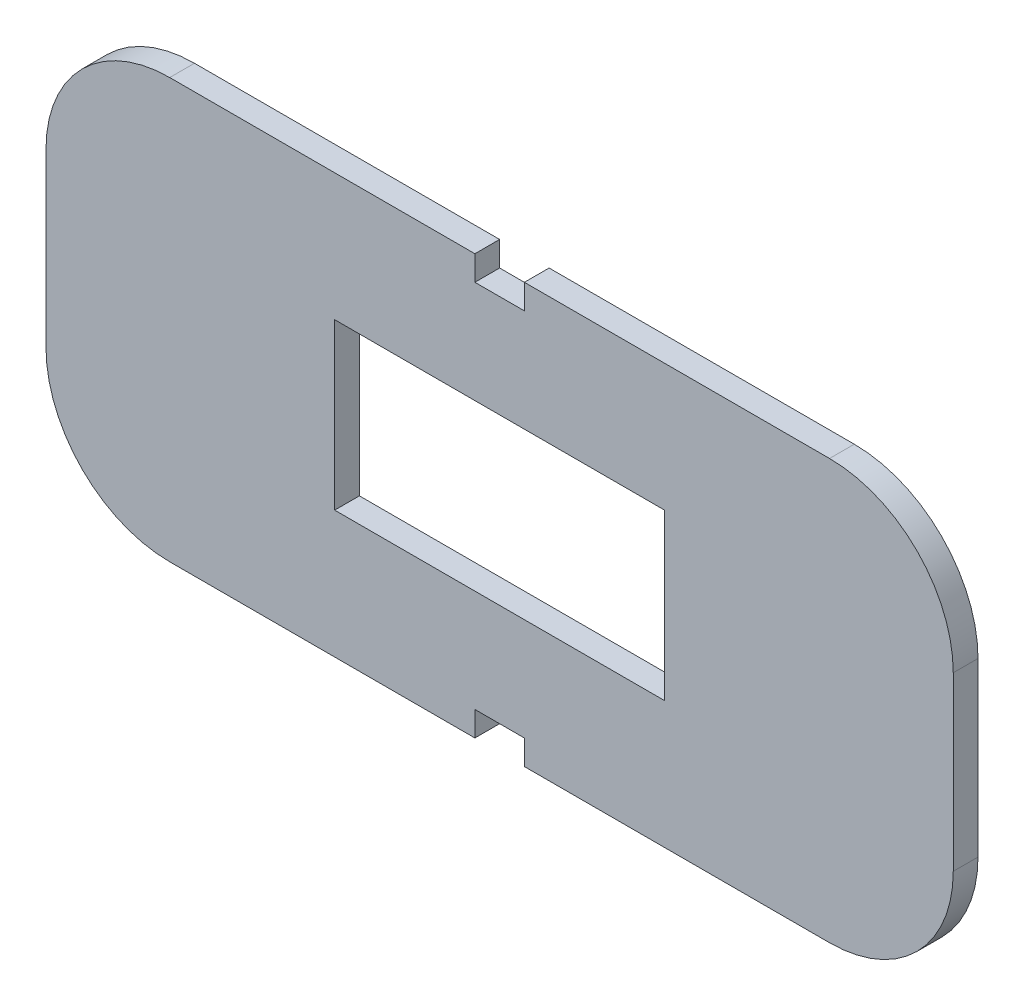
ISO-10303-21;
HEADER;
FILE_DESCRIPTION(('STEP AP214'),'2;1');
FILE_NAME('part.step','',(''),(''),'','','');
FILE_SCHEMA(('AUTOMOTIVE_DESIGN { 1 0 10303 214 1 1 1 1 }'));
ENDSEC;
DATA;
#1=APPLICATION_CONTEXT('core data for automotive mechanical design processes');
#2=APPLICATION_PROTOCOL_DEFINITION('international standard','automotive_design',2000,#1);
#3=PRODUCT_CONTEXT('',#1,'mechanical');
#4=PRODUCT('Part','Part','',(#3));
#5=PRODUCT_RELATED_PRODUCT_CATEGORY('part','',(#4));
#6=PRODUCT_DEFINITION_FORMATION('','',#4);
#7=PRODUCT_DEFINITION_CONTEXT('part definition',#1,'design');
#8=PRODUCT_DEFINITION('design','',#6,#7);
#9=PRODUCT_DEFINITION_SHAPE('','',#8);
#10=(LENGTH_UNIT() NAMED_UNIT(*) SI_UNIT(.MILLI.,.METRE.));
#11=(NAMED_UNIT(*) PLANE_ANGLE_UNIT() SI_UNIT($,.RADIAN.));
#12=(NAMED_UNIT(*) SI_UNIT($,.STERADIAN.) SOLID_ANGLE_UNIT());
#13=UNCERTAINTY_MEASURE_WITH_UNIT(LENGTH_MEASURE(1.E-05),#10,'distance_accuracy_value','');
#14=(GEOMETRIC_REPRESENTATION_CONTEXT(3) GLOBAL_UNCERTAINTY_ASSIGNED_CONTEXT((#13)) GLOBAL_UNIT_ASSIGNED_CONTEXT((#10,
#11,#12)) REPRESENTATION_CONTEXT('',''));
#15=CARTESIAN_POINT('',(0.,0.,0.));
#16=DIRECTION('',(0.,0.,1.));
#17=DIRECTION('',(1.,0.,0.));
#18=AXIS2_PLACEMENT_3D('',#15,#16,#17);
#19=CARTESIAN_POINT('',(0.,0.,3.));
#20=DIRECTION('',(-1.,0.,0.));
#21=DIRECTION('',(0.,-1.,0.));
#22=AXIS2_PLACEMENT_3D('',#19,#20,#21);
#23=PLANE('',#22);
#24=DIRECTION('',(0.,1.,0.));
#25=VECTOR('',#24,1.);
#26=CARTESIAN_POINT('',(0.,0.,0.));
#27=LINE('',#26,#25);
#28=CARTESIAN_POINT('',(0.,15.,0.));
#29=VERTEX_POINT('',#28);
#30=CARTESIAN_POINT('',(0.,35.85,0.));
#31=VERTEX_POINT('',#30);
#32=EDGE_CURVE('E281',#29,#31,#27,.T.);
#33=ORIENTED_EDGE('',*,*,#32,.F.);
#34=DIRECTION('',(0.,0.,-1.));
#35=VECTOR('',#34,1.);
#36=CARTESIAN_POINT('',(0.,15.,3.));
#37=LINE('',#36,#35);
#38=CARTESIAN_POINT('',(0.,15.,3.));
#39=VERTEX_POINT('',#38);
#40=EDGE_CURVE('E419',#29,#39,#37,.F.);
#41=ORIENTED_EDGE('',*,*,#40,.T.);
#42=DIRECTION('',(0.,1.,0.));
#43=VECTOR('',#42,1.);
#44=CARTESIAN_POINT('',(0.,0.,3.));
#45=LINE('',#44,#43);
#46=CARTESIAN_POINT('',(0.,35.85,3.));
#47=VERTEX_POINT('',#46);
#48=EDGE_CURVE('E287',#39,#47,#45,.T.);
#49=ORIENTED_EDGE('',*,*,#48,.T.);
#50=DIRECTION('',(0.,0.,-1.));
#51=VECTOR('',#50,1.);
#52=CARTESIAN_POINT('',(0.,35.85,3.));
#53=LINE('',#52,#51);
#54=EDGE_CURVE('E415',#47,#31,#53,.T.);
#55=ORIENTED_EDGE('',*,*,#54,.T.);
#56=EDGE_LOOP('',(#33,#41,#49,#55));
#57=FACE_BOUND('',#56,.T.);
#58=ADVANCED_FACE('F91',(#57),#23,.T.);
#59=CARTESIAN_POINT('',(0.,0.,3.));
#60=DIRECTION('',(0.,1.,0.));
#61=DIRECTION('',(-1.,0.,0.));
#62=AXIS2_PLACEMENT_3D('',#59,#60,#61);
#63=PLANE('',#62);
#64=DIRECTION('',(1.,0.,0.));
#65=VECTOR('',#64,1.);
#66=CARTESIAN_POINT('',(0.,0.,3.));
#67=LINE('',#66,#65);
#68=CARTESIAN_POINT('',(15.,0.,3.));
#69=VERTEX_POINT('',#68);
#70=CARTESIAN_POINT('',(52.,0.,3.));
#71=VERTEX_POINT('',#70);
#72=EDGE_CURVE('E326',#69,#71,#67,.T.);
#73=ORIENTED_EDGE('',*,*,#72,.F.);
#74=DIRECTION('',(0.,0.,-1.));
#75=VECTOR('',#74,1.);
#76=CARTESIAN_POINT('',(15.,0.,0.));
#77=LINE('',#76,#75);
#78=CARTESIAN_POINT('',(15.,0.,0.));
#79=VERTEX_POINT('',#78);
#80=EDGE_CURVE('E375',#69,#79,#77,.T.);
#81=ORIENTED_EDGE('',*,*,#80,.T.);
#82=DIRECTION('',(1.,0.,0.));
#83=VECTOR('',#82,1.);
#84=CARTESIAN_POINT('',(0.,0.,0.));
#85=LINE('',#84,#83);
#86=CARTESIAN_POINT('',(52.,0.,0.));
#87=VERTEX_POINT('',#86);
#88=EDGE_CURVE('E292',#79,#87,#85,.T.);
#89=ORIENTED_EDGE('',*,*,#88,.T.);
#90=DIRECTION('',(0.,0.,-1.));
#91=VECTOR('',#90,1.);
#92=CARTESIAN_POINT('',(52.,0.,3.));
#93=LINE('',#92,#91);
#94=EDGE_CURVE('E371',#71,#87,#93,.T.);
#95=ORIENTED_EDGE('',*,*,#94,.F.);
#96=EDGE_LOOP('',(#73,#81,#89,#95));
#97=FACE_BOUND('',#96,.T.);
#98=ADVANCED_FACE('F495',(#97),#63,.F.);
#99=CARTESIAN_POINT('',(52.,0.,3.));
#100=DIRECTION('',(-1.,0.,0.));
#101=DIRECTION('',(0.,-1.,0.));
#102=AXIS2_PLACEMENT_3D('',#99,#100,#101);
#103=PLANE('',#102);
#104=DIRECTION('',(0.,1.,0.));
#105=VECTOR('',#104,1.);
#106=CARTESIAN_POINT('',(52.,0.,0.));
#107=LINE('',#106,#105);
#108=CARTESIAN_POINT('',(52.,2.99999999999998,0.));
#109=VERTEX_POINT('',#108);
#110=EDGE_CURVE('E366',#87,#109,#107,.T.);
#111=ORIENTED_EDGE('',*,*,#110,.T.);
#112=DIRECTION('',(0.,0.,-1.));
#113=VECTOR('',#112,1.);
#114=CARTESIAN_POINT('',(52.,2.99999999999998,3.));
#115=LINE('',#114,#113);
#116=CARTESIAN_POINT('',(52.,2.99999999999998,3.));
#117=VERTEX_POINT('',#116);
#118=EDGE_CURVE('E376',#117,#109,#115,.T.);
#119=ORIENTED_EDGE('',*,*,#118,.F.);
#120=DIRECTION('',(0.,1.,0.));
#121=VECTOR('',#120,1.);
#122=CARTESIAN_POINT('',(52.,0.,3.));
#123=LINE('',#122,#121);
#124=EDGE_CURVE('E323',#71,#117,#123,.T.);
#125=ORIENTED_EDGE('',*,*,#124,.F.);
#126=ORIENTED_EDGE('',*,*,#94,.T.);
#127=EDGE_LOOP('',(#111,#119,#125,#126));
#128=FACE_BOUND('',#127,.T.);
#129=ADVANCED_FACE('F502',(#128),#103,.F.);
#130=CARTESIAN_POINT('',(52.,2.99999999999998,3.));
#131=DIRECTION('',(0.,1.,0.));
#132=DIRECTION('',(0.,0.,1.));
#133=AXIS2_PLACEMENT_3D('',#130,#131,#132);
#134=PLANE('',#133);
#135=DIRECTION('',(1.,0.,0.));
#136=VECTOR('',#135,1.);
#137=CARTESIAN_POINT('',(52.,2.99999999999998,0.));
#138=LINE('',#137,#136);
#139=CARTESIAN_POINT('',(58.,2.99999999999998,0.));
#140=VERTEX_POINT('',#139);
#141=EDGE_CURVE('E363',#109,#140,#138,.T.);
#142=ORIENTED_EDGE('',*,*,#141,.T.);
#143=DIRECTION('',(0.,0.,-1.));
#144=VECTOR('',#143,1.);
#145=CARTESIAN_POINT('',(58.,2.99999999999998,3.));
#146=LINE('',#145,#144);
#147=CARTESIAN_POINT('',(58.,2.99999999999998,3.));
#148=VERTEX_POINT('',#147);
#149=EDGE_CURVE('E380',#148,#140,#146,.T.);
#150=ORIENTED_EDGE('',*,*,#149,.F.);
#151=DIRECTION('',(1.,0.,0.));
#152=VECTOR('',#151,1.);
#153=CARTESIAN_POINT('',(52.,2.99999999999998,3.));
#154=LINE('',#153,#152);
#155=EDGE_CURVE('E320',#117,#148,#154,.T.);
#156=ORIENTED_EDGE('',*,*,#155,.F.);
#157=ORIENTED_EDGE('',*,*,#118,.T.);
#158=EDGE_LOOP('',(#142,#150,#156,#157));
#159=FACE_BOUND('',#158,.T.);
#160=ADVANCED_FACE('F505',(#159),#134,.F.);
#161=CARTESIAN_POINT('',(58.,2.99999999999998,3.));
#162=DIRECTION('',(1.,0.,0.));
#163=DIRECTION('',(0.,1.,0.));
#164=AXIS2_PLACEMENT_3D('',#161,#162,#163);
#165=PLANE('',#164);
#166=DIRECTION('',(0.,-1.,0.));
#167=VECTOR('',#166,1.);
#168=CARTESIAN_POINT('',(58.,2.99999999999998,0.));
#169=LINE('',#168,#167);
#170=CARTESIAN_POINT('',(58.,0.,0.));
#171=VERTEX_POINT('',#170);
#172=EDGE_CURVE('E360',#140,#171,#169,.T.);
#173=ORIENTED_EDGE('',*,*,#172,.T.);
#174=DIRECTION('',(0.,0.,-1.));
#175=VECTOR('',#174,1.);
#176=CARTESIAN_POINT('',(58.,0.,3.));
#177=LINE('',#176,#175);
#178=CARTESIAN_POINT('',(58.,0.,3.));
#179=VERTEX_POINT('',#178);
#180=EDGE_CURVE('E384',#179,#171,#177,.T.);
#181=ORIENTED_EDGE('',*,*,#180,.F.);
#182=DIRECTION('',(0.,-1.,0.));
#183=VECTOR('',#182,1.);
#184=CARTESIAN_POINT('',(58.,2.99999999999998,3.));
#185=LINE('',#184,#183);
#186=EDGE_CURVE('E317',#148,#179,#185,.T.);
#187=ORIENTED_EDGE('',*,*,#186,.F.);
#188=ORIENTED_EDGE('',*,*,#149,.T.);
#189=EDGE_LOOP('',(#173,#181,#187,#188));
#190=FACE_BOUND('',#189,.T.);
#191=ADVANCED_FACE('F508',(#190),#165,.F.);
#192=CARTESIAN_POINT('',(58.,0.,3.));
#193=DIRECTION('',(0.,1.,0.));
#194=DIRECTION('',(-1.,0.,0.));
#195=AXIS2_PLACEMENT_3D('',#192,#193,#194);
#196=PLANE('',#195);
#197=DIRECTION('',(1.,0.,0.));
#198=VECTOR('',#197,1.);
#199=CARTESIAN_POINT('',(58.,0.,0.));
#200=LINE('',#199,#198);
#201=CARTESIAN_POINT('',(95.,0.,0.));
#202=VERTEX_POINT('',#201);
#203=EDGE_CURVE('E356',#171,#202,#200,.T.);
#204=ORIENTED_EDGE('',*,*,#203,.T.);
#205=DIRECTION('',(0.,0.,-1.));
#206=VECTOR('',#205,1.);
#207=CARTESIAN_POINT('',(95.,0.,3.));
#208=LINE('',#207,#206);
#209=CARTESIAN_POINT('',(95.,0.,3.));
#210=VERTEX_POINT('',#209);
#211=EDGE_CURVE('E100',#202,#210,#208,.F.);
#212=ORIENTED_EDGE('',*,*,#211,.T.);
#213=DIRECTION('',(1.,0.,0.));
#214=VECTOR('',#213,1.);
#215=CARTESIAN_POINT('',(58.,0.,3.));
#216=LINE('',#215,#214);
#217=EDGE_CURVE('E313',#179,#210,#216,.T.);
#218=ORIENTED_EDGE('',*,*,#217,.F.);
#219=ORIENTED_EDGE('',*,*,#180,.T.);
#220=EDGE_LOOP('',(#204,#212,#218,#219));
#221=FACE_BOUND('',#220,.T.);
#222=ADVANCED_FACE('F445',(#221),#196,.F.);
#223=CARTESIAN_POINT('',(110.,0.,3.));
#224=DIRECTION('',(-1.,0.,0.));
#225=DIRECTION('',(0.,0.,1.));
#226=AXIS2_PLACEMENT_3D('',#223,#224,#225);
#227=PLANE('',#226);
#228=DIRECTION('',(0.,1.,0.));
#229=VECTOR('',#228,1.);
#230=CARTESIAN_POINT('',(110.,0.,3.));
#231=LINE('',#230,#229);
#232=CARTESIAN_POINT('',(110.,15.,3.));
#233=VERTEX_POINT('',#232);
#234=CARTESIAN_POINT('',(110.,35.85,3.));
#235=VERTEX_POINT('',#234);
#236=EDGE_CURVE('E310',#233,#235,#231,.T.);
#237=ORIENTED_EDGE('',*,*,#236,.F.);
#238=DIRECTION('',(0.,0.,-1.));
#239=VECTOR('',#238,1.);
#240=CARTESIAN_POINT('',(110.,15.,3.));
#241=LINE('',#240,#239);
#242=CARTESIAN_POINT('',(110.,15.,0.));
#243=VERTEX_POINT('',#242);
#244=EDGE_CURVE('E438',#233,#243,#241,.T.);
#245=ORIENTED_EDGE('',*,*,#244,.T.);
#246=DIRECTION('',(0.,1.,0.));
#247=VECTOR('',#246,1.);
#248=CARTESIAN_POINT('',(110.,0.,0.));
#249=LINE('',#248,#247);
#250=CARTESIAN_POINT('',(110.,35.85,0.));
#251=VERTEX_POINT('',#250);
#252=EDGE_CURVE('E352',#243,#251,#249,.T.);
#253=ORIENTED_EDGE('',*,*,#252,.T.);
#254=DIRECTION('',(0.,0.,-1.));
#255=VECTOR('',#254,1.);
#256=CARTESIAN_POINT('',(110.,35.85,3.));
#257=LINE('',#256,#255);
#258=EDGE_CURVE('E435',#251,#235,#257,.F.);
#259=ORIENTED_EDGE('',*,*,#258,.T.);
#260=EDGE_LOOP('',(#237,#245,#253,#259));
#261=FACE_BOUND('',#260,.T.);
#262=ADVANCED_FACE('F457',(#261),#227,.F.);
#263=CARTESIAN_POINT('',(58.,50.85,3.));
#264=DIRECTION('',(0.,1.,0.));
#265=DIRECTION('',(-1.,0.,0.));
#266=AXIS2_PLACEMENT_3D('',#263,#264,#265);
#267=PLANE('',#266);
#268=DIRECTION('',(1.,0.,0.));
#269=VECTOR('',#268,1.);
#270=CARTESIAN_POINT('',(58.,50.85,3.));
#271=LINE('',#270,#269);
#272=CARTESIAN_POINT('',(58.,50.85,3.));
#273=VERTEX_POINT('',#272);
#274=CARTESIAN_POINT('',(95.,50.85,3.));
#275=VERTEX_POINT('',#274);
#276=EDGE_CURVE('E307',#273,#275,#271,.T.);
#277=ORIENTED_EDGE('',*,*,#276,.T.);
#278=DIRECTION('',(0.,0.,-1.));
#279=VECTOR('',#278,1.);
#280=CARTESIAN_POINT('',(95.,50.85,0.));
#281=LINE('',#280,#279);
#282=CARTESIAN_POINT('',(95.,50.85,0.));
#283=VERTEX_POINT('',#282);
#284=EDGE_CURVE('E12',#275,#283,#281,.T.);
#285=ORIENTED_EDGE('',*,*,#284,.T.);
#286=DIRECTION('',(1.,0.,0.));
#287=VECTOR('',#286,1.);
#288=CARTESIAN_POINT('',(58.,50.85,0.));
#289=LINE('',#288,#287);
#290=CARTESIAN_POINT('',(58.,50.85,0.));
#291=VERTEX_POINT('',#290);
#292=EDGE_CURVE('E348',#291,#283,#289,.T.);
#293=ORIENTED_EDGE('',*,*,#292,.F.);
#294=DIRECTION('',(0.,0.,-1.));
#295=VECTOR('',#294,1.);
#296=CARTESIAN_POINT('',(58.,50.85,3.));
#297=LINE('',#296,#295);
#298=EDGE_CURVE('E388',#273,#291,#297,.T.);
#299=ORIENTED_EDGE('',*,*,#298,.F.);
#300=EDGE_LOOP('',(#277,#285,#293,#299));
#301=FACE_BOUND('',#300,.T.);
#302=ADVANCED_FACE('F466',(#301),#267,.T.);
#303=CARTESIAN_POINT('',(58.,47.85,3.));
#304=DIRECTION('',(-1.,0.,0.));
#305=DIRECTION('',(0.,0.,1.));
#306=AXIS2_PLACEMENT_3D('',#303,#304,#305);
#307=PLANE('',#306);
#308=DIRECTION('',(0.,1.,0.));
#309=VECTOR('',#308,1.);
#310=CARTESIAN_POINT('',(58.,47.85,0.));
#311=LINE('',#310,#309);
#312=CARTESIAN_POINT('',(58.,47.85,0.));
#313=VERTEX_POINT('',#312);
#314=EDGE_CURVE('E344',#313,#291,#311,.T.);
#315=ORIENTED_EDGE('',*,*,#314,.F.);
#316=DIRECTION('',(0.,0.,-1.));
#317=VECTOR('',#316,1.);
#318=CARTESIAN_POINT('',(58.,47.85,3.));
#319=LINE('',#318,#317);
#320=CARTESIAN_POINT('',(58.,47.85,3.));
#321=VERTEX_POINT('',#320);
#322=EDGE_CURVE('E391',#321,#313,#319,.T.);
#323=ORIENTED_EDGE('',*,*,#322,.F.);
#324=DIRECTION('',(0.,1.,0.));
#325=VECTOR('',#324,1.);
#326=CARTESIAN_POINT('',(58.,47.85,3.));
#327=LINE('',#326,#325);
#328=EDGE_CURVE('E303',#321,#273,#327,.T.);
#329=ORIENTED_EDGE('',*,*,#328,.T.);
#330=ORIENTED_EDGE('',*,*,#298,.T.);
#331=EDGE_LOOP('',(#315,#323,#329,#330));
#332=FACE_BOUND('',#331,.T.);
#333=ADVANCED_FACE('F471',(#332),#307,.T.);
#334=CARTESIAN_POINT('',(52.,47.85,3.));
#335=DIRECTION('',(0.,1.,0.));
#336=DIRECTION('',(0.,0.,1.));
#337=AXIS2_PLACEMENT_3D('',#334,#335,#336);
#338=PLANE('',#337);
#339=DIRECTION('',(1.,0.,0.));
#340=VECTOR('',#339,1.);
#341=CARTESIAN_POINT('',(52.,47.85,0.));
#342=LINE('',#341,#340);
#343=CARTESIAN_POINT('',(52.,47.85,0.));
#344=VERTEX_POINT('',#343);
#345=EDGE_CURVE('E340',#344,#313,#342,.T.);
#346=ORIENTED_EDGE('',*,*,#345,.F.);
#347=DIRECTION('',(0.,0.,-1.));
#348=VECTOR('',#347,1.);
#349=CARTESIAN_POINT('',(52.,47.85,3.));
#350=LINE('',#349,#348);
#351=CARTESIAN_POINT('',(52.,47.85,3.));
#352=VERTEX_POINT('',#351);
#353=EDGE_CURVE('E394',#352,#344,#350,.T.);
#354=ORIENTED_EDGE('',*,*,#353,.F.);
#355=DIRECTION('',(1.,0.,0.));
#356=VECTOR('',#355,1.);
#357=CARTESIAN_POINT('',(52.,47.85,3.));
#358=LINE('',#357,#356);
#359=EDGE_CURVE('E299',#352,#321,#358,.T.);
#360=ORIENTED_EDGE('',*,*,#359,.T.);
#361=ORIENTED_EDGE('',*,*,#322,.T.);
#362=EDGE_LOOP('',(#346,#354,#360,#361));
#363=FACE_BOUND('',#362,.T.);
#364=ADVANCED_FACE('F474',(#363),#338,.T.);
#365=CARTESIAN_POINT('',(52.,50.85,3.));
#366=DIRECTION('',(1.,0.,0.));
#367=DIRECTION('',(0.,1.,0.));
#368=AXIS2_PLACEMENT_3D('',#365,#366,#367);
#369=PLANE('',#368);
#370=DIRECTION('',(0.,-1.,0.));
#371=VECTOR('',#370,1.);
#372=CARTESIAN_POINT('',(52.,50.85,0.));
#373=LINE('',#372,#371);
#374=CARTESIAN_POINT('',(52.,50.85,0.));
#375=VERTEX_POINT('',#374);
#376=EDGE_CURVE('E336',#375,#344,#373,.T.);
#377=ORIENTED_EDGE('',*,*,#376,.F.);
#378=DIRECTION('',(0.,0.,-1.));
#379=VECTOR('',#378,1.);
#380=CARTESIAN_POINT('',(52.,50.85,3.));
#381=LINE('',#380,#379);
#382=CARTESIAN_POINT('',(52.,50.85,3.));
#383=VERTEX_POINT('',#382);
#384=EDGE_CURVE('E329',#383,#375,#381,.T.);
#385=ORIENTED_EDGE('',*,*,#384,.F.);
#386=DIRECTION('',(0.,-1.,0.));
#387=VECTOR('',#386,1.);
#388=CARTESIAN_POINT('',(52.,50.85,3.));
#389=LINE('',#388,#387);
#390=EDGE_CURVE('E295',#383,#352,#389,.T.);
#391=ORIENTED_EDGE('',*,*,#390,.T.);
#392=ORIENTED_EDGE('',*,*,#353,.T.);
#393=EDGE_LOOP('',(#377,#385,#391,#392));
#394=FACE_BOUND('',#393,.T.);
#395=ADVANCED_FACE('F479',(#394),#369,.T.);
#396=CARTESIAN_POINT('',(0.,50.85,3.));
#397=DIRECTION('',(0.,1.,0.));
#398=DIRECTION('',(-1.,0.,0.));
#399=AXIS2_PLACEMENT_3D('',#396,#397,#398);
#400=PLANE('',#399);
#401=DIRECTION('',(1.,0.,0.));
#402=VECTOR('',#401,1.);
#403=CARTESIAN_POINT('',(0.,50.85,0.));
#404=LINE('',#403,#402);
#405=CARTESIAN_POINT('',(15.,50.85,0.));
#406=VERTEX_POINT('',#405);
#407=EDGE_CURVE('E333',#406,#375,#404,.T.);
#408=ORIENTED_EDGE('',*,*,#407,.F.);
#409=DIRECTION('',(0.,0.,-1.));
#410=VECTOR('',#409,1.);
#411=CARTESIAN_POINT('',(15.,50.85,3.));
#412=LINE('',#411,#410);
#413=CARTESIAN_POINT('',(15.,50.85,3.));
#414=VERTEX_POINT('',#413);
#415=EDGE_CURVE('E107',#406,#414,#412,.F.);
#416=ORIENTED_EDGE('',*,*,#415,.T.);
#417=DIRECTION('',(1.,0.,0.));
#418=VECTOR('',#417,1.);
#419=CARTESIAN_POINT('',(0.,50.85,3.));
#420=LINE('',#419,#418);
#421=EDGE_CURVE('E291',#414,#383,#420,.T.);
#422=ORIENTED_EDGE('',*,*,#421,.T.);
#423=ORIENTED_EDGE('',*,*,#384,.T.);
#424=EDGE_LOOP('',(#408,#416,#422,#423));
#425=FACE_BOUND('',#424,.T.);
#426=ADVANCED_FACE('F480',(#425),#400,.T.);
#427=CARTESIAN_POINT('',(0.,0.,3.));
#428=DIRECTION('',(0.,0.,-1.));
#429=DIRECTION('',(-1.,0.,0.));
#430=AXIS2_PLACEMENT_3D('',#427,#428,#429);
#431=PLANE('',#430);
#432=DIRECTION('',(0.,1.,0.));
#433=VECTOR('',#432,1.);
#434=CARTESIAN_POINT('',(35.,15.425,3.));
#435=LINE('',#434,#433);
#436=CARTESIAN_POINT('',(35.,15.425,3.));
#437=VERTEX_POINT('',#436);
#438=CARTESIAN_POINT('',(35.,35.425,3.));
#439=VERTEX_POINT('',#438);
#440=EDGE_CURVE('E254',#437,#439,#435,.T.);
#441=ORIENTED_EDGE('',*,*,#440,.T.);
#442=DIRECTION('',(1.,0.,0.));
#443=VECTOR('',#442,1.);
#444=CARTESIAN_POINT('',(35.,35.425,3.));
#445=LINE('',#444,#443);
#446=CARTESIAN_POINT('',(75.,35.425,3.));
#447=VERTEX_POINT('',#446);
#448=EDGE_CURVE('E245',#439,#447,#445,.T.);
#449=ORIENTED_EDGE('',*,*,#448,.T.);
#450=DIRECTION('',(0.,1.,0.));
#451=VECTOR('',#450,1.);
#452=CARTESIAN_POINT('',(75.,15.425,3.));
#453=LINE('',#452,#451);
#454=CARTESIAN_POINT('',(75.,15.425,3.));
#455=VERTEX_POINT('',#454);
#456=EDGE_CURVE('E232',#455,#447,#453,.T.);
#457=ORIENTED_EDGE('',*,*,#456,.F.);
#458=DIRECTION('',(1.,0.,0.));
#459=VECTOR('',#458,1.);
#460=CARTESIAN_POINT('',(35.,15.425,3.));
#461=LINE('',#460,#459);
#462=EDGE_CURVE('E244',#437,#455,#461,.T.);
#463=ORIENTED_EDGE('',*,*,#462,.F.);
#464=EDGE_LOOP('',(#441,#449,#457,#463));
#465=FACE_BOUND('',#464,.T.);
#466=ORIENTED_EDGE('',*,*,#48,.F.);
#467=CARTESIAN_POINT('',(15.,15.,3.));
#468=DIRECTION('',(0.,0.,-1.));
#469=DIRECTION('',(-1.,0.,0.));
#470=AXIS2_PLACEMENT_3D('',#467,#468,#469);
#471=CIRCLE('',#470,15.);
#472=EDGE_CURVE('E430',#39,#69,#471,.F.);
#473=ORIENTED_EDGE('',*,*,#472,.T.);
#474=ORIENTED_EDGE('',*,*,#72,.T.);
#475=ORIENTED_EDGE('',*,*,#124,.T.);
#476=ORIENTED_EDGE('',*,*,#155,.T.);
#477=ORIENTED_EDGE('',*,*,#186,.T.);
#478=ORIENTED_EDGE('',*,*,#217,.T.);
#479=CARTESIAN_POINT('',(95.,15.,3.));
#480=DIRECTION('',(0.,0.,-1.));
#481=DIRECTION('',(-1.,0.,0.));
#482=AXIS2_PLACEMENT_3D('',#479,#480,#481);
#483=CIRCLE('',#482,15.);
#484=EDGE_CURVE('E424',#210,#233,#483,.F.);
#485=ORIENTED_EDGE('',*,*,#484,.T.);
#486=ORIENTED_EDGE('',*,*,#236,.T.);
#487=CARTESIAN_POINT('',(95.,35.85,3.));
#488=DIRECTION('',(0.,0.,-1.));
#489=DIRECTION('',(-1.,0.,0.));
#490=AXIS2_PLACEMENT_3D('',#487,#488,#489);
#491=CIRCLE('',#490,15.);
#492=EDGE_CURVE('E115',#235,#275,#491,.F.);
#493=ORIENTED_EDGE('',*,*,#492,.T.);
#494=ORIENTED_EDGE('',*,*,#276,.F.);
#495=ORIENTED_EDGE('',*,*,#328,.F.);
#496=ORIENTED_EDGE('',*,*,#359,.F.);
#497=ORIENTED_EDGE('',*,*,#390,.F.);
#498=ORIENTED_EDGE('',*,*,#421,.F.);
#499=CARTESIAN_POINT('',(15.,35.85,3.));
#500=DIRECTION('',(0.,0.,-1.));
#501=DIRECTION('',(-1.,0.,0.));
#502=AXIS2_PLACEMENT_3D('',#499,#500,#501);
#503=CIRCLE('',#502,15.);
#504=EDGE_CURVE('E427',#414,#47,#503,.F.);
#505=ORIENTED_EDGE('',*,*,#504,.T.);
#506=EDGE_LOOP('',(#466,#473,#474,#475,#476,#477,#478,#485,#486,#493,#494,#495,#496,#497,#498,#505));
#507=FACE_BOUND('',#506,.T.);
#508=ADVANCED_FACE('F256',(#465,#507),#431,.F.);
#509=CARTESIAN_POINT('',(0.,0.,0.));
#510=DIRECTION('',(0.,0.,-1.));
#511=DIRECTION('',(-1.,0.,0.));
#512=AXIS2_PLACEMENT_3D('',#509,#510,#511);
#513=PLANE('',#512);
#514=DIRECTION('',(1.,0.,0.));
#515=VECTOR('',#514,1.);
#516=CARTESIAN_POINT('',(35.,35.425,0.));
#517=LINE('',#516,#515);
#518=CARTESIAN_POINT('',(35.,35.425,0.));
#519=VERTEX_POINT('',#518);
#520=CARTESIAN_POINT('',(75.,35.425,0.));
#521=VERTEX_POINT('',#520);
#522=EDGE_CURVE('E252',#519,#521,#517,.T.);
#523=ORIENTED_EDGE('',*,*,#522,.F.);
#524=DIRECTION('',(0.,1.,0.));
#525=VECTOR('',#524,1.);
#526=CARTESIAN_POINT('',(35.,15.425,0.));
#527=LINE('',#526,#525);
#528=CARTESIAN_POINT('',(35.,15.425,0.));
#529=VERTEX_POINT('',#528);
#530=EDGE_CURVE('E259',#529,#519,#527,.T.);
#531=ORIENTED_EDGE('',*,*,#530,.F.);
#532=DIRECTION('',(1.,0.,0.));
#533=VECTOR('',#532,1.);
#534=CARTESIAN_POINT('',(35.,15.425,0.));
#535=LINE('',#534,#533);
#536=CARTESIAN_POINT('',(75.,15.425,0.));
#537=VERTEX_POINT('',#536);
#538=EDGE_CURVE('E263',#529,#537,#535,.T.);
#539=ORIENTED_EDGE('',*,*,#538,.T.);
#540=DIRECTION('',(0.,1.,0.));
#541=VECTOR('',#540,1.);
#542=CARTESIAN_POINT('',(75.,15.425,0.));
#543=LINE('',#542,#541);
#544=EDGE_CURVE('E272',#537,#521,#543,.T.);
#545=ORIENTED_EDGE('',*,*,#544,.T.);
#546=EDGE_LOOP('',(#523,#531,#539,#545));
#547=FACE_BOUND('',#546,.T.);
#548=ORIENTED_EDGE('',*,*,#88,.F.);
#549=CARTESIAN_POINT('',(15.,15.,0.));
#550=DIRECTION('',(0.,0.,-1.));
#551=DIRECTION('',(-1.,0.,0.));
#552=AXIS2_PLACEMENT_3D('',#549,#550,#551);
#553=CIRCLE('',#552,15.);
#554=EDGE_CURVE('E412',#79,#29,#553,.T.);
#555=ORIENTED_EDGE('',*,*,#554,.T.);
#556=ORIENTED_EDGE('',*,*,#32,.T.);
#557=CARTESIAN_POINT('',(15.,35.85,0.));
#558=DIRECTION('',(0.,0.,-1.));
#559=DIRECTION('',(-1.,0.,0.));
#560=AXIS2_PLACEMENT_3D('',#557,#558,#559);
#561=CIRCLE('',#560,15.);
#562=EDGE_CURVE('E409',#31,#406,#561,.T.);
#563=ORIENTED_EDGE('',*,*,#562,.T.);
#564=ORIENTED_EDGE('',*,*,#407,.T.);
#565=ORIENTED_EDGE('',*,*,#376,.T.);
#566=ORIENTED_EDGE('',*,*,#345,.T.);
#567=ORIENTED_EDGE('',*,*,#314,.T.);
#568=ORIENTED_EDGE('',*,*,#292,.T.);
#569=CARTESIAN_POINT('',(95.,35.85,0.));
#570=DIRECTION('',(0.,0.,-1.));
#571=DIRECTION('',(-1.,0.,0.));
#572=AXIS2_PLACEMENT_3D('',#569,#570,#571);
#573=CIRCLE('',#572,15.);
#574=EDGE_CURVE('E403',#283,#251,#573,.T.);
#575=ORIENTED_EDGE('',*,*,#574,.T.);
#576=ORIENTED_EDGE('',*,*,#252,.F.);
#577=CARTESIAN_POINT('',(95.,15.,0.));
#578=DIRECTION('',(0.,0.,-1.));
#579=DIRECTION('',(-1.,0.,0.));
#580=AXIS2_PLACEMENT_3D('',#577,#578,#579);
#581=CIRCLE('',#580,15.);
#582=EDGE_CURVE('E406',#243,#202,#581,.T.);
#583=ORIENTED_EDGE('',*,*,#582,.T.);
#584=ORIENTED_EDGE('',*,*,#203,.F.);
#585=ORIENTED_EDGE('',*,*,#172,.F.);
#586=ORIENTED_EDGE('',*,*,#141,.F.);
#587=ORIENTED_EDGE('',*,*,#110,.F.);
#588=EDGE_LOOP('',(#548,#555,#556,#563,#564,#565,#566,#567,#568,#575,#576,#583,#584,#585,#586,#587));
#589=FACE_BOUND('',#588,.T.);
#590=ADVANCED_FACE('F461',(#547,#589),#513,.T.);
#591=CARTESIAN_POINT('',(35.,35.425,3.));
#592=DIRECTION('',(0.,1.,0.));
#593=DIRECTION('',(0.,0.,1.));
#594=AXIS2_PLACEMENT_3D('',#591,#592,#593);
#595=PLANE('',#594);
#596=ORIENTED_EDGE('',*,*,#522,.T.);
#597=DIRECTION('',(0.,0.,-1.));
#598=VECTOR('',#597,1.);
#599=CARTESIAN_POINT('',(75.,35.425,3.));
#600=LINE('',#599,#598);
#601=EDGE_CURVE('E236',#447,#521,#600,.T.);
#602=ORIENTED_EDGE('',*,*,#601,.F.);
#603=ORIENTED_EDGE('',*,*,#448,.F.);
#604=DIRECTION('',(0.,0.,-1.));
#605=VECTOR('',#604,1.);
#606=CARTESIAN_POINT('',(35.,35.425,3.));
#607=LINE('',#606,#605);
#608=EDGE_CURVE('E278',#439,#519,#607,.T.);
#609=ORIENTED_EDGE('',*,*,#608,.T.);
#610=EDGE_LOOP('',(#596,#602,#603,#609));
#611=FACE_BOUND('',#610,.T.);
#612=ADVANCED_FACE('F249',(#611),#595,.F.);
#613=CARTESIAN_POINT('',(35.,15.425,3.));
#614=DIRECTION('',(-1.,0.,0.));
#615=DIRECTION('',(0.,0.,1.));
#616=AXIS2_PLACEMENT_3D('',#613,#614,#615);
#617=PLANE('',#616);
#618=ORIENTED_EDGE('',*,*,#530,.T.);
#619=ORIENTED_EDGE('',*,*,#608,.F.);
#620=ORIENTED_EDGE('',*,*,#440,.F.);
#621=DIRECTION('',(0.,0.,-1.));
#622=VECTOR('',#621,1.);
#623=CARTESIAN_POINT('',(35.,15.425,3.));
#624=LINE('',#623,#622);
#625=EDGE_CURVE('E282',#437,#529,#624,.T.);
#626=ORIENTED_EDGE('',*,*,#625,.T.);
#627=EDGE_LOOP('',(#618,#619,#620,#626));
#628=FACE_BOUND('',#627,.T.);
#629=ADVANCED_FACE('F647',(#628),#617,.F.);
#630=CARTESIAN_POINT('',(35.,15.425,3.));
#631=DIRECTION('',(0.,1.,0.));
#632=DIRECTION('',(0.,0.,1.));
#633=AXIS2_PLACEMENT_3D('',#630,#631,#632);
#634=PLANE('',#633);
#635=ORIENTED_EDGE('',*,*,#538,.F.);
#636=ORIENTED_EDGE('',*,*,#625,.F.);
#637=ORIENTED_EDGE('',*,*,#462,.T.);
#638=DIRECTION('',(0.,0.,-1.));
#639=VECTOR('',#638,1.);
#640=CARTESIAN_POINT('',(75.,15.425,3.));
#641=LINE('',#640,#639);
#642=EDGE_CURVE('E238',#455,#537,#641,.T.);
#643=ORIENTED_EDGE('',*,*,#642,.T.);
#644=EDGE_LOOP('',(#635,#636,#637,#643));
#645=FACE_BOUND('',#644,.T.);
#646=ADVANCED_FACE('F637',(#645),#634,.T.);
#647=CARTESIAN_POINT('',(75.,15.425,3.));
#648=DIRECTION('',(-1.,0.,0.));
#649=DIRECTION('',(0.,0.,1.));
#650=AXIS2_PLACEMENT_3D('',#647,#648,#649);
#651=PLANE('',#650);
#652=ORIENTED_EDGE('',*,*,#544,.F.);
#653=ORIENTED_EDGE('',*,*,#642,.F.);
#654=ORIENTED_EDGE('',*,*,#456,.T.);
#655=ORIENTED_EDGE('',*,*,#601,.T.);
#656=EDGE_LOOP('',(#652,#653,#654,#655));
#657=FACE_BOUND('',#656,.T.);
#658=ADVANCED_FACE('F235',(#657),#651,.T.);
#659=CARTESIAN_POINT('',(15.,15.,3.));
#660=DIRECTION('',(0.,0.,1.));
#661=DIRECTION('',(1.,0.,0.));
#662=AXIS2_PLACEMENT_3D('',#659,#660,#661);
#663=CYLINDRICAL_SURFACE('',#662,15.);
#664=ORIENTED_EDGE('',*,*,#472,.F.);
#665=ORIENTED_EDGE('',*,*,#40,.F.);
#666=ORIENTED_EDGE('',*,*,#554,.F.);
#667=ORIENTED_EDGE('',*,*,#80,.F.);
#668=EDGE_LOOP('',(#664,#665,#666,#667));
#669=FACE_BOUND('',#668,.T.);
#670=ADVANCED_FACE('F492',(#669),#663,.T.);
#671=CARTESIAN_POINT('',(15.,35.85,3.));
#672=DIRECTION('',(0.,0.,-1.));
#673=DIRECTION('',(-1.,0.,0.));
#674=AXIS2_PLACEMENT_3D('',#671,#672,#673);
#675=CYLINDRICAL_SURFACE('',#674,15.);
#676=ORIENTED_EDGE('',*,*,#504,.F.);
#677=ORIENTED_EDGE('',*,*,#415,.F.);
#678=ORIENTED_EDGE('',*,*,#562,.F.);
#679=ORIENTED_EDGE('',*,*,#54,.F.);
#680=EDGE_LOOP('',(#676,#677,#678,#679));
#681=FACE_BOUND('',#680,.T.);
#682=ADVANCED_FACE('F484',(#681),#675,.T.);
#683=CARTESIAN_POINT('',(95.,15.,3.));
#684=DIRECTION('',(0.,0.,-1.));
#685=DIRECTION('',(-1.,0.,0.));
#686=AXIS2_PLACEMENT_3D('',#683,#684,#685);
#687=CYLINDRICAL_SURFACE('',#686,15.);
#688=ORIENTED_EDGE('',*,*,#484,.F.);
#689=ORIENTED_EDGE('',*,*,#211,.F.);
#690=ORIENTED_EDGE('',*,*,#582,.F.);
#691=ORIENTED_EDGE('',*,*,#244,.F.);
#692=EDGE_LOOP('',(#688,#689,#690,#691));
#693=FACE_BOUND('',#692,.T.);
#694=ADVANCED_FACE('F454',(#693),#687,.T.);
#695=CARTESIAN_POINT('',(95.,35.85,3.));
#696=DIRECTION('',(0.,0.,1.));
#697=DIRECTION('',(1.,0.,0.));
#698=AXIS2_PLACEMENT_3D('',#695,#696,#697);
#699=CYLINDRICAL_SURFACE('',#698,15.);
#700=ORIENTED_EDGE('',*,*,#492,.F.);
#701=ORIENTED_EDGE('',*,*,#258,.F.);
#702=ORIENTED_EDGE('',*,*,#574,.F.);
#703=ORIENTED_EDGE('',*,*,#284,.F.);
#704=EDGE_LOOP('',(#700,#701,#702,#703));
#705=FACE_BOUND('',#704,.T.);
#706=ADVANCED_FACE('F93',(#705),#699,.T.);
#707=CLOSED_SHELL('',(#58,#98,#129,#160,#191,#222,#262,#302,#333,#364,#395,#426,#508,#590,#612,
#629,#646,#658,#670,#682,#694,#706));
#708=MANIFOLD_SOLID_BREP('B2',#707);
#709=ADVANCED_BREP_SHAPE_REPRESENTATION('',(#18,#708),#14);
#710=SHAPE_DEFINITION_REPRESENTATION(#9,#709);
ENDSEC;
END-ISO-10303-21;
